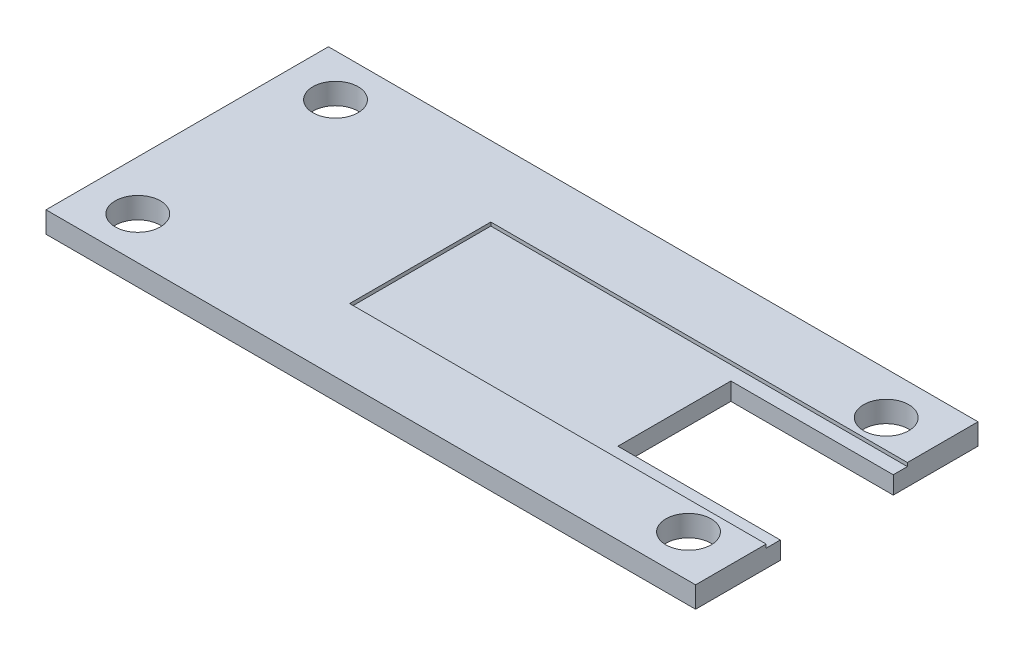
ISO-10303-21;
HEADER;
FILE_DESCRIPTION(('STEP AP214'),'2;1');
FILE_NAME('part.step','',(''),(''),'','','');
FILE_SCHEMA(('AUTOMOTIVE_DESIGN { 1 0 10303 214 1 1 1 1 }'));
ENDSEC;
DATA;
#1=APPLICATION_CONTEXT('core data for automotive mechanical design processes');
#2=APPLICATION_PROTOCOL_DEFINITION('international standard','automotive_design',2000,#1);
#3=PRODUCT_CONTEXT('',#1,'mechanical');
#4=PRODUCT('Part','Part','',(#3));
#5=PRODUCT_RELATED_PRODUCT_CATEGORY('part','',(#4));
#6=PRODUCT_DEFINITION_FORMATION('','',#4);
#7=PRODUCT_DEFINITION_CONTEXT('part definition',#1,'design');
#8=PRODUCT_DEFINITION('design','',#6,#7);
#9=PRODUCT_DEFINITION_SHAPE('','',#8);
#10=(LENGTH_UNIT() NAMED_UNIT(*) SI_UNIT(.MILLI.,.METRE.));
#11=(NAMED_UNIT(*) PLANE_ANGLE_UNIT() SI_UNIT($,.RADIAN.));
#12=(NAMED_UNIT(*) SI_UNIT($,.STERADIAN.) SOLID_ANGLE_UNIT());
#13=UNCERTAINTY_MEASURE_WITH_UNIT(LENGTH_MEASURE(1.E-05),#10,'distance_accuracy_value','');
#14=(GEOMETRIC_REPRESENTATION_CONTEXT(3) GLOBAL_UNCERTAINTY_ASSIGNED_CONTEXT((#13)) GLOBAL_UNIT_ASSIGNED_CONTEXT((#10,
#11,#12)) REPRESENTATION_CONTEXT('',''));
#15=CARTESIAN_POINT('',(0.,0.,0.));
#16=DIRECTION('',(0.,0.,1.));
#17=DIRECTION('',(1.,0.,0.));
#18=AXIS2_PLACEMENT_3D('',#15,#16,#17);
#19=CARTESIAN_POINT('',(23.,1.5,-10.));
#20=DIRECTION('',(-1.,0.,0.));
#21=DIRECTION('',(0.,0.,1.));
#22=AXIS2_PLACEMENT_3D('',#19,#20,#21);
#23=PLANE('',#22);
#24=DIRECTION('',(0.,0.,-1.));
#25=VECTOR('',#24,1.);
#26=CARTESIAN_POINT('',(23.,1.25,-5.));
#27=LINE('',#26,#25);
#28=CARTESIAN_POINT('',(23.,1.25,-4.));
#29=VERTEX_POINT('',#28);
#30=CARTESIAN_POINT('',(23.,1.25,-5.));
#31=VERTEX_POINT('',#30);
#32=EDGE_CURVE('E156',#29,#31,#27,.T.);
#33=ORIENTED_EDGE('',*,*,#32,.F.);
#34=DIRECTION('',(0.,1.,0.));
#35=VECTOR('',#34,1.);
#36=CARTESIAN_POINT('',(23.,-29.,-4.));
#37=LINE('',#36,#35);
#38=CARTESIAN_POINT('',(23.,0.,-4.));
#39=VERTEX_POINT('',#38);
#40=EDGE_CURVE('E151',#39,#29,#37,.T.);
#41=ORIENTED_EDGE('',*,*,#40,.F.);
#42=DIRECTION('',(0.,0.,-1.));
#43=VECTOR('',#42,1.);
#44=CARTESIAN_POINT('',(23.,0.,-10.));
#45=LINE('',#44,#43);
#46=CARTESIAN_POINT('',(23.,0.,-10.));
#47=VERTEX_POINT('',#46);
#48=EDGE_CURVE('E223',#39,#47,#45,.T.);
#49=ORIENTED_EDGE('',*,*,#48,.T.);
#50=DIRECTION('',(0.,-1.,0.));
#51=VECTOR('',#50,1.);
#52=CARTESIAN_POINT('',(23.,1.5,-10.));
#53=LINE('',#52,#51);
#54=CARTESIAN_POINT('',(23.,1.5,-10.));
#55=VERTEX_POINT('',#54);
#56=EDGE_CURVE('E228',#55,#47,#53,.T.);
#57=ORIENTED_EDGE('',*,*,#56,.F.);
#58=DIRECTION('',(0.,0.,-1.));
#59=VECTOR('',#58,1.);
#60=CARTESIAN_POINT('',(23.,1.5,-10.));
#61=LINE('',#60,#59);
#62=CARTESIAN_POINT('',(23.,1.5,-5.));
#63=VERTEX_POINT('',#62);
#64=EDGE_CURVE('E212',#63,#55,#61,.T.);
#65=ORIENTED_EDGE('',*,*,#64,.F.);
#66=DIRECTION('',(0.,1.,0.));
#67=VECTOR('',#66,1.);
#68=CARTESIAN_POINT('',(23.,1.25,-5.));
#69=LINE('',#68,#67);
#70=EDGE_CURVE('E177',#31,#63,#69,.T.);
#71=ORIENTED_EDGE('',*,*,#70,.F.);
#72=EDGE_LOOP('',(#33,#41,#49,#57,#65,#71));
#73=FACE_BOUND('',#72,.T.);
#74=ADVANCED_FACE('F43',(#73),#23,.F.);
#75=CARTESIAN_POINT('',(0.,1.5,0.));
#76=DIRECTION('',(0.,1.,0.));
#77=DIRECTION('',(0.,0.,1.));
#78=AXIS2_PLACEMENT_3D('',#75,#76,#77);
#79=PLANE('',#78);
#80=DIRECTION('',(-1.,0.,0.));
#81=VECTOR('',#80,1.);
#82=CARTESIAN_POINT('',(-6.5,1.5,-5.));
#83=LINE('',#82,#81);
#84=CARTESIAN_POINT('',(-6.5,1.5,-5.));
#85=VERTEX_POINT('',#84);
#86=EDGE_CURVE('E170',#63,#85,#83,.T.);
#87=ORIENTED_EDGE('',*,*,#86,.F.);
#88=ORIENTED_EDGE('',*,*,#64,.T.);
#89=DIRECTION('',(-1.,0.,0.));
#90=VECTOR('',#89,1.);
#91=CARTESIAN_POINT('',(-23.,1.5,-10.));
#92=LINE('',#91,#90);
#93=CARTESIAN_POINT('',(-23.,1.5,-10.));
#94=VERTEX_POINT('',#93);
#95=EDGE_CURVE('E216',#55,#94,#92,.T.);
#96=ORIENTED_EDGE('',*,*,#95,.T.);
#97=DIRECTION('',(0.,0.,1.));
#98=VECTOR('',#97,1.);
#99=CARTESIAN_POINT('',(-23.,1.5,-10.));
#100=LINE('',#99,#98);
#101=CARTESIAN_POINT('',(-23.,1.5,10.));
#102=VERTEX_POINT('',#101);
#103=EDGE_CURVE('E206',#94,#102,#100,.T.);
#104=ORIENTED_EDGE('',*,*,#103,.T.);
#105=DIRECTION('',(1.,0.,0.));
#106=VECTOR('',#105,1.);
#107=CARTESIAN_POINT('',(-23.,1.5,10.));
#108=LINE('',#107,#106);
#109=CARTESIAN_POINT('',(23.,1.5,10.));
#110=VERTEX_POINT('',#109);
#111=EDGE_CURVE('E209',#102,#110,#108,.T.);
#112=ORIENTED_EDGE('',*,*,#111,.T.);
#113=CARTESIAN_POINT('',(23.,1.5,5.));
#114=VERTEX_POINT('',#113);
#115=EDGE_CURVE('E213',#110,#114,#61,.T.);
#116=ORIENTED_EDGE('',*,*,#115,.T.);
#117=DIRECTION('',(1.,0.,0.));
#118=VECTOR('',#117,1.);
#119=CARTESIAN_POINT('',(-6.5,1.5,5.));
#120=LINE('',#119,#118);
#121=CARTESIAN_POINT('',(-6.5,1.5,5.));
#122=VERTEX_POINT('',#121);
#123=EDGE_CURVE('E167',#122,#114,#120,.T.);
#124=ORIENTED_EDGE('',*,*,#123,.F.);
#125=DIRECTION('',(0.,0.,1.));
#126=VECTOR('',#125,1.);
#127=CARTESIAN_POINT('',(-6.5,1.5,-5.));
#128=LINE('',#127,#126);
#129=EDGE_CURVE('E164',#85,#122,#128,.T.);
#130=ORIENTED_EDGE('',*,*,#129,.F.);
#131=EDGE_LOOP('',(#87,#88,#96,#104,#112,#116,#124,#130));
#132=FACE_BOUND('',#131,.T.);
#133=CARTESIAN_POINT('',(19.5,1.5,7.));
#134=DIRECTION('',(0.,1.,0.));
#135=DIRECTION('',(0.,0.,1.));
#136=AXIS2_PLACEMENT_3D('',#133,#134,#135);
#137=CIRCLE('',#136,1.6);
#138=CARTESIAN_POINT('',(19.5,1.5,8.6));
#139=VERTEX_POINT('',#138);
#140=EDGE_CURVE('E188',#139,#139,#137,.T.);
#141=ORIENTED_EDGE('',*,*,#140,.F.);
#142=EDGE_LOOP('',(#141));
#143=FACE_BOUND('',#142,.T.);
#144=CARTESIAN_POINT('',(-19.5,1.5,-7.));
#145=DIRECTION('',(0.,1.,0.));
#146=DIRECTION('',(0.,0.,1.));
#147=AXIS2_PLACEMENT_3D('',#144,#145,#146);
#148=CIRCLE('',#147,1.6);
#149=CARTESIAN_POINT('',(-19.5,1.5,-5.4));
#150=VERTEX_POINT('',#149);
#151=EDGE_CURVE('E200',#150,#150,#148,.T.);
#152=ORIENTED_EDGE('',*,*,#151,.F.);
#153=EDGE_LOOP('',(#152));
#154=FACE_BOUND('',#153,.T.);
#155=CARTESIAN_POINT('',(19.5,1.5,-7.));
#156=DIRECTION('',(0.,1.,0.));
#157=DIRECTION('',(0.,0.,-1.));
#158=AXIS2_PLACEMENT_3D('',#155,#156,#157);
#159=CIRCLE('',#158,1.6);
#160=CARTESIAN_POINT('',(19.5,1.5,-8.6));
#161=VERTEX_POINT('',#160);
#162=EDGE_CURVE('E194',#161,#161,#159,.T.);
#163=ORIENTED_EDGE('',*,*,#162,.F.);
#164=EDGE_LOOP('',(#163));
#165=FACE_BOUND('',#164,.T.);
#166=CARTESIAN_POINT('',(-19.5,1.5,7.));
#167=DIRECTION('',(0.,1.,0.));
#168=DIRECTION('',(0.,0.,-1.));
#169=AXIS2_PLACEMENT_3D('',#166,#167,#168);
#170=CIRCLE('',#169,1.6);
#171=CARTESIAN_POINT('',(-19.5,1.5,5.4));
#172=VERTEX_POINT('',#171);
#173=EDGE_CURVE('E182',#172,#172,#170,.T.);
#174=ORIENTED_EDGE('',*,*,#173,.F.);
#175=EDGE_LOOP('',(#174));
#176=FACE_BOUND('',#175,.T.);
#177=ADVANCED_FACE('F258',(#132,#143,#154,#165,#176),#79,.T.);
#178=CARTESIAN_POINT('',(0.,0.,0.));
#179=DIRECTION('',(0.,1.,0.));
#180=DIRECTION('',(0.,0.,1.));
#181=AXIS2_PLACEMENT_3D('',#178,#179,#180);
#182=PLANE('',#181);
#183=ORIENTED_EDGE('',*,*,#48,.F.);
#184=DIRECTION('',(-1.,0.,0.));
#185=VECTOR('',#184,1.);
#186=CARTESIAN_POINT('',(0.,0.,-4.));
#187=LINE('',#186,#185);
#188=CARTESIAN_POINT('',(11.5,0.,-4.));
#189=VERTEX_POINT('',#188);
#190=EDGE_CURVE('E241',#39,#189,#187,.T.);
#191=ORIENTED_EDGE('',*,*,#190,.T.);
#192=DIRECTION('',(0.,0.,1.));
#193=VECTOR('',#192,1.);
#194=CARTESIAN_POINT('',(11.5,0.,0.));
#195=LINE('',#194,#193);
#196=CARTESIAN_POINT('',(11.5,0.,4.));
#197=VERTEX_POINT('',#196);
#198=EDGE_CURVE('E168',#189,#197,#195,.T.);
#199=ORIENTED_EDGE('',*,*,#198,.T.);
#200=DIRECTION('',(1.,0.,0.));
#201=VECTOR('',#200,1.);
#202=CARTESIAN_POINT('',(0.,0.,4.));
#203=LINE('',#202,#201);
#204=CARTESIAN_POINT('',(23.,0.,4.));
#205=VERTEX_POINT('',#204);
#206=EDGE_CURVE('E239',#197,#205,#203,.T.);
#207=ORIENTED_EDGE('',*,*,#206,.T.);
#208=CARTESIAN_POINT('',(23.,0.,10.));
#209=VERTEX_POINT('',#208);
#210=EDGE_CURVE('E150',#209,#205,#45,.T.);
#211=ORIENTED_EDGE('',*,*,#210,.F.);
#212=DIRECTION('',(1.,0.,0.));
#213=VECTOR('',#212,1.);
#214=CARTESIAN_POINT('',(-23.,0.,10.));
#215=LINE('',#214,#213);
#216=CARTESIAN_POINT('',(-23.,0.,10.));
#217=VERTEX_POINT('',#216);
#218=EDGE_CURVE('E221',#217,#209,#215,.T.);
#219=ORIENTED_EDGE('',*,*,#218,.F.);
#220=DIRECTION('',(0.,0.,1.));
#221=VECTOR('',#220,1.);
#222=CARTESIAN_POINT('',(-23.,0.,-10.));
#223=LINE('',#222,#221);
#224=CARTESIAN_POINT('',(-23.,0.,-10.));
#225=VERTEX_POINT('',#224);
#226=EDGE_CURVE('E203',#225,#217,#223,.T.);
#227=ORIENTED_EDGE('',*,*,#226,.F.);
#228=DIRECTION('',(-1.,0.,0.));
#229=VECTOR('',#228,1.);
#230=CARTESIAN_POINT('',(-23.,0.,-10.));
#231=LINE('',#230,#229);
#232=EDGE_CURVE('E210',#47,#225,#231,.T.);
#233=ORIENTED_EDGE('',*,*,#232,.F.);
#234=EDGE_LOOP('',(#183,#191,#199,#207,#211,#219,#227,#233));
#235=FACE_BOUND('',#234,.T.);
#236=CARTESIAN_POINT('',(-19.5,0.,-7.));
#237=DIRECTION('',(0.,1.,0.));
#238=DIRECTION('',(0.,0.,1.));
#239=AXIS2_PLACEMENT_3D('',#236,#237,#238);
#240=CIRCLE('',#239,1.6);
#241=CARTESIAN_POINT('',(-19.5,0.,-5.4));
#242=VERTEX_POINT('',#241);
#243=EDGE_CURVE('E197',#242,#242,#240,.T.);
#244=ORIENTED_EDGE('',*,*,#243,.T.);
#245=EDGE_LOOP('',(#244));
#246=FACE_BOUND('',#245,.T.);
#247=CARTESIAN_POINT('',(19.5,0.,-7.));
#248=DIRECTION('',(0.,1.,0.));
#249=DIRECTION('',(0.,0.,-1.));
#250=AXIS2_PLACEMENT_3D('',#247,#248,#249);
#251=CIRCLE('',#250,1.6);
#252=CARTESIAN_POINT('',(19.5,0.,-8.6));
#253=VERTEX_POINT('',#252);
#254=EDGE_CURVE('E191',#253,#253,#251,.T.);
#255=ORIENTED_EDGE('',*,*,#254,.T.);
#256=EDGE_LOOP('',(#255));
#257=FACE_BOUND('',#256,.T.);
#258=CARTESIAN_POINT('',(19.5,0.,7.));
#259=DIRECTION('',(0.,1.,0.));
#260=DIRECTION('',(0.,0.,1.));
#261=AXIS2_PLACEMENT_3D('',#258,#259,#260);
#262=CIRCLE('',#261,1.6);
#263=CARTESIAN_POINT('',(19.5,0.,8.6));
#264=VERTEX_POINT('',#263);
#265=EDGE_CURVE('E185',#264,#264,#262,.T.);
#266=ORIENTED_EDGE('',*,*,#265,.T.);
#267=EDGE_LOOP('',(#266));
#268=FACE_BOUND('',#267,.T.);
#269=CARTESIAN_POINT('',(-19.5,0.,7.));
#270=DIRECTION('',(0.,1.,0.));
#271=DIRECTION('',(0.,0.,-1.));
#272=AXIS2_PLACEMENT_3D('',#269,#270,#271);
#273=CIRCLE('',#272,1.6);
#274=CARTESIAN_POINT('',(-19.5,0.,5.4));
#275=VERTEX_POINT('',#274);
#276=EDGE_CURVE('E176',#275,#275,#273,.T.);
#277=ORIENTED_EDGE('',*,*,#276,.T.);
#278=EDGE_LOOP('',(#277));
#279=FACE_BOUND('',#278,.T.);
#280=ADVANCED_FACE('F235',(#235,#246,#257,#268,#279),#182,.F.);
#281=CARTESIAN_POINT('',(-23.,1.5,-10.));
#282=DIRECTION('',(1.,0.,0.));
#283=DIRECTION('',(0.,0.,-1.));
#284=AXIS2_PLACEMENT_3D('',#281,#282,#283);
#285=PLANE('',#284);
#286=ORIENTED_EDGE('',*,*,#226,.T.);
#287=DIRECTION('',(0.,-1.,0.));
#288=VECTOR('',#287,1.);
#289=CARTESIAN_POINT('',(-23.,1.5,10.));
#290=LINE('',#289,#288);
#291=EDGE_CURVE('E11',#102,#217,#290,.T.);
#292=ORIENTED_EDGE('',*,*,#291,.F.);
#293=ORIENTED_EDGE('',*,*,#103,.F.);
#294=DIRECTION('',(0.,-1.,0.));
#295=VECTOR('',#294,1.);
#296=CARTESIAN_POINT('',(-23.,1.5,-10.));
#297=LINE('',#296,#295);
#298=EDGE_CURVE('E218',#94,#225,#297,.T.);
#299=ORIENTED_EDGE('',*,*,#298,.T.);
#300=EDGE_LOOP('',(#286,#292,#293,#299));
#301=FACE_BOUND('',#300,.T.);
#302=ADVANCED_FACE('F45',(#301),#285,.F.);
#303=CARTESIAN_POINT('',(-23.,1.5,10.));
#304=DIRECTION('',(0.,0.,-1.));
#305=DIRECTION('',(-1.,0.,0.));
#306=AXIS2_PLACEMENT_3D('',#303,#304,#305);
#307=PLANE('',#306);
#308=ORIENTED_EDGE('',*,*,#218,.T.);
#309=DIRECTION('',(0.,-1.,0.));
#310=VECTOR('',#309,1.);
#311=CARTESIAN_POINT('',(23.,1.5,10.));
#312=LINE('',#311,#310);
#313=EDGE_CURVE('E51',#110,#209,#312,.T.);
#314=ORIENTED_EDGE('',*,*,#313,.F.);
#315=ORIENTED_EDGE('',*,*,#111,.F.);
#316=ORIENTED_EDGE('',*,*,#291,.T.);
#317=EDGE_LOOP('',(#308,#314,#315,#316));
#318=FACE_BOUND('',#317,.T.);
#319=ADVANCED_FACE('F262',(#318),#307,.F.);
#320=ORIENTED_EDGE('',*,*,#210,.T.);
#321=DIRECTION('',(0.,1.,0.));
#322=VECTOR('',#321,1.);
#323=CARTESIAN_POINT('',(23.,-29.,4.));
#324=LINE('',#323,#322);
#325=CARTESIAN_POINT('',(23.,1.25,4.));
#326=VERTEX_POINT('',#325);
#327=EDGE_CURVE('E137',#205,#326,#324,.T.);
#328=ORIENTED_EDGE('',*,*,#327,.T.);
#329=CARTESIAN_POINT('',(23.,1.25,5.));
#330=VERTEX_POINT('',#329);
#331=EDGE_CURVE('E147',#330,#326,#27,.T.);
#332=ORIENTED_EDGE('',*,*,#331,.F.);
#333=DIRECTION('',(0.,1.,0.));
#334=VECTOR('',#333,1.);
#335=CARTESIAN_POINT('',(23.,1.25,5.));
#336=LINE('',#335,#334);
#337=EDGE_CURVE('E179',#330,#114,#336,.T.);
#338=ORIENTED_EDGE('',*,*,#337,.T.);
#339=ORIENTED_EDGE('',*,*,#115,.F.);
#340=ORIENTED_EDGE('',*,*,#313,.T.);
#341=EDGE_LOOP('',(#320,#328,#332,#338,#339,#340));
#342=FACE_BOUND('',#341,.T.);
#343=ADVANCED_FACE('F145',(#342),#23,.F.);
#344=CARTESIAN_POINT('',(-23.,1.5,-10.));
#345=DIRECTION('',(0.,0.,1.));
#346=DIRECTION('',(1.,0.,0.));
#347=AXIS2_PLACEMENT_3D('',#344,#345,#346);
#348=PLANE('',#347);
#349=ORIENTED_EDGE('',*,*,#232,.T.);
#350=ORIENTED_EDGE('',*,*,#298,.F.);
#351=ORIENTED_EDGE('',*,*,#95,.F.);
#352=ORIENTED_EDGE('',*,*,#56,.T.);
#353=EDGE_LOOP('',(#349,#350,#351,#352));
#354=FACE_BOUND('',#353,.T.);
#355=ADVANCED_FACE('F267',(#354),#348,.F.);
#356=CARTESIAN_POINT('',(-19.5,1.5,-7.));
#357=DIRECTION('',(0.,-1.,0.));
#358=DIRECTION('',(0.,0.,-1.));
#359=AXIS2_PLACEMENT_3D('',#356,#357,#358);
#360=CYLINDRICAL_SURFACE('',#359,1.6);
#361=ORIENTED_EDGE('',*,*,#151,.T.);
#362=EDGE_LOOP('',(#361));
#363=FACE_BOUND('',#362,.T.);
#364=ORIENTED_EDGE('',*,*,#243,.F.);
#365=EDGE_LOOP('',(#364));
#366=FACE_BOUND('',#365,.T.);
#367=ADVANCED_FACE('F306',(#363,#366),#360,.F.);
#368=CARTESIAN_POINT('',(19.5,1.5,-7.));
#369=DIRECTION('',(0.,-1.,0.));
#370=DIRECTION('',(0.,0.,-1.));
#371=AXIS2_PLACEMENT_3D('',#368,#369,#370);
#372=CYLINDRICAL_SURFACE('',#371,1.6);
#373=ORIENTED_EDGE('',*,*,#162,.T.);
#374=EDGE_LOOP('',(#373));
#375=FACE_BOUND('',#374,.T.);
#376=ORIENTED_EDGE('',*,*,#254,.F.);
#377=EDGE_LOOP('',(#376));
#378=FACE_BOUND('',#377,.T.);
#379=ADVANCED_FACE('F319',(#375,#378),#372,.F.);
#380=CARTESIAN_POINT('',(19.5,1.5,7.));
#381=DIRECTION('',(0.,-1.,0.));
#382=DIRECTION('',(0.,0.,-1.));
#383=AXIS2_PLACEMENT_3D('',#380,#381,#382);
#384=CYLINDRICAL_SURFACE('',#383,1.6);
#385=ORIENTED_EDGE('',*,*,#140,.T.);
#386=EDGE_LOOP('',(#385));
#387=FACE_BOUND('',#386,.T.);
#388=ORIENTED_EDGE('',*,*,#265,.F.);
#389=EDGE_LOOP('',(#388));
#390=FACE_BOUND('',#389,.T.);
#391=ADVANCED_FACE('F323',(#387,#390),#384,.F.);
#392=CARTESIAN_POINT('',(-19.5,1.5,7.));
#393=DIRECTION('',(0.,-1.,0.));
#394=DIRECTION('',(0.,0.,-1.));
#395=AXIS2_PLACEMENT_3D('',#392,#393,#394);
#396=CYLINDRICAL_SURFACE('',#395,1.6);
#397=ORIENTED_EDGE('',*,*,#173,.T.);
#398=EDGE_LOOP('',(#397));
#399=FACE_BOUND('',#398,.T.);
#400=ORIENTED_EDGE('',*,*,#276,.F.);
#401=EDGE_LOOP('',(#400));
#402=FACE_BOUND('',#401,.T.);
#403=ADVANCED_FACE('F291',(#399,#402),#396,.F.);
#404=CARTESIAN_POINT('',(-6.5,1.25,-5.));
#405=DIRECTION('',(-1.,0.,0.));
#406=DIRECTION('',(0.,0.,1.));
#407=AXIS2_PLACEMENT_3D('',#404,#405,#406);
#408=PLANE('',#407);
#409=ORIENTED_EDGE('',*,*,#129,.T.);
#410=DIRECTION('',(0.,1.,0.));
#411=VECTOR('',#410,1.);
#412=CARTESIAN_POINT('',(-6.5,1.25,5.));
#413=LINE('',#412,#411);
#414=CARTESIAN_POINT('',(-6.5,1.25,5.));
#415=VERTEX_POINT('',#414);
#416=EDGE_CURVE('E159',#415,#122,#413,.T.);
#417=ORIENTED_EDGE('',*,*,#416,.F.);
#418=DIRECTION('',(0.,0.,1.));
#419=VECTOR('',#418,1.);
#420=CARTESIAN_POINT('',(-6.5,1.25,-5.));
#421=LINE('',#420,#419);
#422=CARTESIAN_POINT('',(-6.5,1.25,-5.));
#423=VERTEX_POINT('',#422);
#424=EDGE_CURVE('E173',#423,#415,#421,.T.);
#425=ORIENTED_EDGE('',*,*,#424,.F.);
#426=DIRECTION('',(0.,1.,0.));
#427=VECTOR('',#426,1.);
#428=CARTESIAN_POINT('',(-6.5,1.25,-5.));
#429=LINE('',#428,#427);
#430=EDGE_CURVE('E174',#423,#85,#429,.T.);
#431=ORIENTED_EDGE('',*,*,#430,.T.);
#432=EDGE_LOOP('',(#409,#417,#425,#431));
#433=FACE_BOUND('',#432,.T.);
#434=ADVANCED_FACE('F251',(#433),#408,.F.);
#435=CARTESIAN_POINT('',(-6.5,1.25,-5.));
#436=DIRECTION('',(0.,0.,-1.));
#437=DIRECTION('',(-1.,0.,0.));
#438=AXIS2_PLACEMENT_3D('',#435,#436,#437);
#439=PLANE('',#438);
#440=ORIENTED_EDGE('',*,*,#86,.T.);
#441=ORIENTED_EDGE('',*,*,#430,.F.);
#442=DIRECTION('',(-1.,0.,0.));
#443=VECTOR('',#442,1.);
#444=CARTESIAN_POINT('',(-6.5,1.25,-5.));
#445=LINE('',#444,#443);
#446=EDGE_CURVE('E155',#31,#423,#445,.T.);
#447=ORIENTED_EDGE('',*,*,#446,.F.);
#448=ORIENTED_EDGE('',*,*,#70,.T.);
#449=EDGE_LOOP('',(#440,#441,#447,#448));
#450=FACE_BOUND('',#449,.T.);
#451=ADVANCED_FACE('F283',(#450),#439,.F.);
#452=CARTESIAN_POINT('',(-6.5,1.25,5.));
#453=DIRECTION('',(0.,0.,1.));
#454=DIRECTION('',(1.,0.,0.));
#455=AXIS2_PLACEMENT_3D('',#452,#453,#454);
#456=PLANE('',#455);
#457=ORIENTED_EDGE('',*,*,#123,.T.);
#458=ORIENTED_EDGE('',*,*,#337,.F.);
#459=DIRECTION('',(1.,0.,0.));
#460=VECTOR('',#459,1.);
#461=CARTESIAN_POINT('',(-6.5,1.25,5.));
#462=LINE('',#461,#460);
#463=EDGE_CURVE('E66',#415,#330,#462,.T.);
#464=ORIENTED_EDGE('',*,*,#463,.F.);
#465=ORIENTED_EDGE('',*,*,#416,.T.);
#466=EDGE_LOOP('',(#457,#458,#464,#465));
#467=FACE_BOUND('',#466,.T.);
#468=ADVANCED_FACE('F255',(#467),#456,.F.);
#469=CARTESIAN_POINT('',(0.,1.25,0.));
#470=DIRECTION('',(0.,1.,0.));
#471=DIRECTION('',(0.,0.,1.));
#472=AXIS2_PLACEMENT_3D('',#469,#470,#471);
#473=PLANE('',#472);
#474=DIRECTION('',(-1.,0.,0.));
#475=VECTOR('',#474,1.);
#476=CARTESIAN_POINT('',(11.5,1.25,-4.));
#477=LINE('',#476,#475);
#478=CARTESIAN_POINT('',(11.5,1.25,-4.));
#479=VERTEX_POINT('',#478);
#480=EDGE_CURVE('E140',#29,#479,#477,.T.);
#481=ORIENTED_EDGE('',*,*,#480,.F.);
#482=ORIENTED_EDGE('',*,*,#32,.T.);
#483=ORIENTED_EDGE('',*,*,#446,.T.);
#484=ORIENTED_EDGE('',*,*,#424,.T.);
#485=ORIENTED_EDGE('',*,*,#463,.T.);
#486=ORIENTED_EDGE('',*,*,#331,.T.);
#487=DIRECTION('',(1.,0.,0.));
#488=VECTOR('',#487,1.);
#489=CARTESIAN_POINT('',(11.5,1.25,4.));
#490=LINE('',#489,#488);
#491=CARTESIAN_POINT('',(11.5,1.25,4.));
#492=VERTEX_POINT('',#491);
#493=EDGE_CURVE('E134',#492,#326,#490,.T.);
#494=ORIENTED_EDGE('',*,*,#493,.F.);
#495=DIRECTION('',(0.,0.,1.));
#496=VECTOR('',#495,1.);
#497=CARTESIAN_POINT('',(11.5,1.25,-4.));
#498=LINE('',#497,#496);
#499=EDGE_CURVE('E58',#479,#492,#498,.T.);
#500=ORIENTED_EDGE('',*,*,#499,.F.);
#501=EDGE_LOOP('',(#481,#482,#483,#484,#485,#486,#494,#500));
#502=FACE_BOUND('',#501,.T.);
#503=ADVANCED_FACE('F154',(#502),#473,.T.);
#504=CARTESIAN_POINT('',(11.5,-29.,-4.));
#505=DIRECTION('',(-1.,0.,0.));
#506=DIRECTION('',(0.,0.,1.));
#507=AXIS2_PLACEMENT_3D('',#504,#505,#506);
#508=PLANE('',#507);
#509=DIRECTION('',(0.,1.,0.));
#510=VECTOR('',#509,1.);
#511=CARTESIAN_POINT('',(11.5,-29.,-4.));
#512=LINE('',#511,#510);
#513=EDGE_CURVE('E242',#189,#479,#512,.T.);
#514=ORIENTED_EDGE('',*,*,#513,.T.);
#515=ORIENTED_EDGE('',*,*,#499,.T.);
#516=DIRECTION('',(0.,1.,0.));
#517=VECTOR('',#516,1.);
#518=CARTESIAN_POINT('',(11.5,-29.,4.));
#519=LINE('',#518,#517);
#520=EDGE_CURVE('E139',#197,#492,#519,.T.);
#521=ORIENTED_EDGE('',*,*,#520,.F.);
#522=ORIENTED_EDGE('',*,*,#198,.F.);
#523=EDGE_LOOP('',(#514,#515,#521,#522));
#524=FACE_BOUND('',#523,.T.);
#525=ADVANCED_FACE('F387',(#524),#508,.F.);
#526=CARTESIAN_POINT('',(11.5,-29.,-4.));
#527=DIRECTION('',(0.,0.,-1.));
#528=DIRECTION('',(-1.,0.,0.));
#529=AXIS2_PLACEMENT_3D('',#526,#527,#528);
#530=PLANE('',#529);
#531=ORIENTED_EDGE('',*,*,#40,.T.);
#532=ORIENTED_EDGE('',*,*,#480,.T.);
#533=ORIENTED_EDGE('',*,*,#513,.F.);
#534=ORIENTED_EDGE('',*,*,#190,.F.);
#535=EDGE_LOOP('',(#531,#532,#533,#534));
#536=FACE_BOUND('',#535,.T.);
#537=ADVANCED_FACE('F281',(#536),#530,.F.);
#538=CARTESIAN_POINT('',(11.5,-29.,4.));
#539=DIRECTION('',(0.,0.,1.));
#540=DIRECTION('',(1.,0.,0.));
#541=AXIS2_PLACEMENT_3D('',#538,#539,#540);
#542=PLANE('',#541);
#543=ORIENTED_EDGE('',*,*,#520,.T.);
#544=ORIENTED_EDGE('',*,*,#493,.T.);
#545=ORIENTED_EDGE('',*,*,#327,.F.);
#546=ORIENTED_EDGE('',*,*,#206,.F.);
#547=EDGE_LOOP('',(#543,#544,#545,#546));
#548=FACE_BOUND('',#547,.T.);
#549=ADVANCED_FACE('F136',(#548),#542,.F.);
#550=CLOSED_SHELL('',(#74,#177,#280,#302,#319,#343,#355,#367,#379,#391,#403,#434,#451,#468,#503,
#525,#537,#549));
#551=MANIFOLD_SOLID_BREP('B2',#550);
#552=ADVANCED_BREP_SHAPE_REPRESENTATION('',(#18,#551),#14);
#553=SHAPE_DEFINITION_REPRESENTATION(#9,#552);
ENDSEC;
END-ISO-10303-21;
